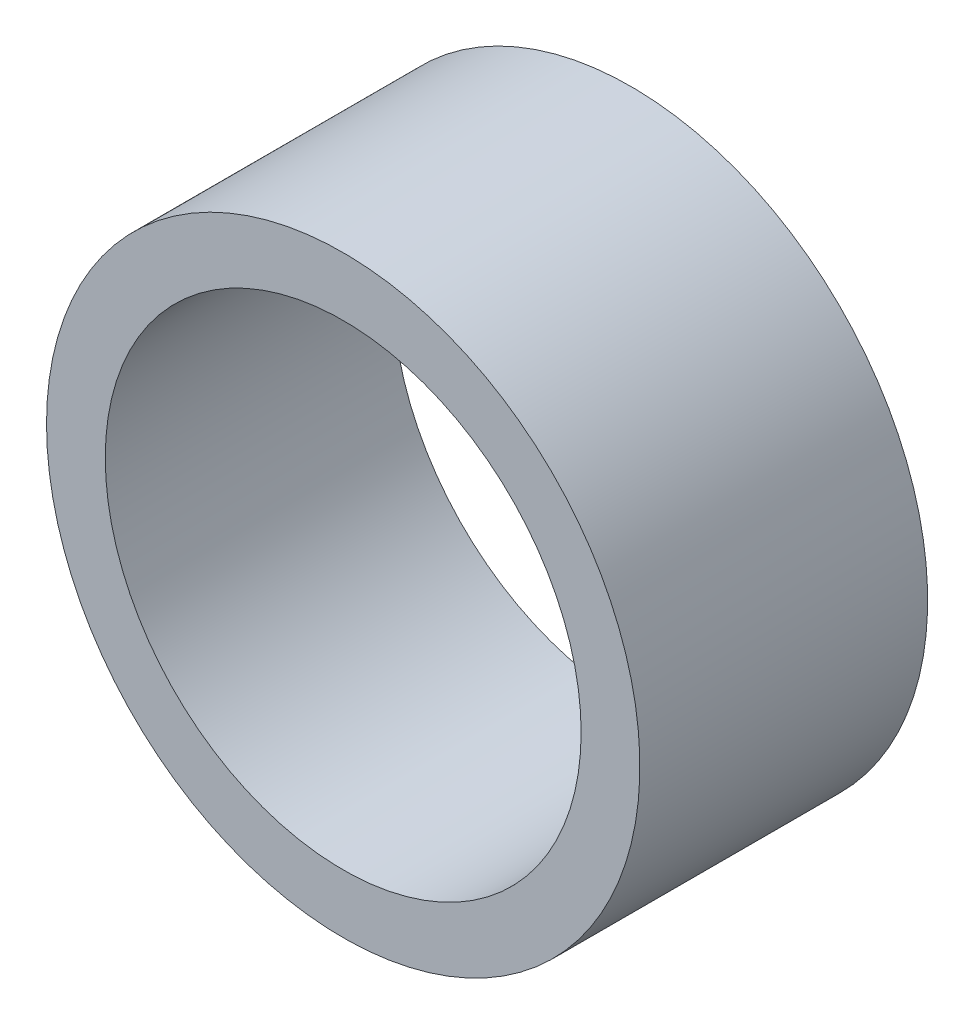
ISO-10303-21;
HEADER;
FILE_DESCRIPTION(('STEP AP214'),'2;1');
FILE_NAME('part.step','',(''),(''),'','','');
FILE_SCHEMA(('AUTOMOTIVE_DESIGN { 1 0 10303 214 1 1 1 1 }'));
ENDSEC;
DATA;
#1=APPLICATION_CONTEXT('core data for automotive mechanical design processes');
#2=APPLICATION_PROTOCOL_DEFINITION('international standard','automotive_design',2000,#1);
#3=PRODUCT_CONTEXT('',#1,'mechanical');
#4=PRODUCT('Part','Part','',(#3));
#5=PRODUCT_RELATED_PRODUCT_CATEGORY('part','',(#4));
#6=PRODUCT_DEFINITION_FORMATION('','',#4);
#7=PRODUCT_DEFINITION_CONTEXT('part definition',#1,'design');
#8=PRODUCT_DEFINITION('design','',#6,#7);
#9=PRODUCT_DEFINITION_SHAPE('','',#8);
#10=(LENGTH_UNIT() NAMED_UNIT(*) SI_UNIT(.MILLI.,.METRE.));
#11=(NAMED_UNIT(*) PLANE_ANGLE_UNIT() SI_UNIT($,.RADIAN.));
#12=(NAMED_UNIT(*) SI_UNIT($,.STERADIAN.) SOLID_ANGLE_UNIT());
#13=UNCERTAINTY_MEASURE_WITH_UNIT(LENGTH_MEASURE(1.E-05),#10,'distance_accuracy_value','');
#14=(GEOMETRIC_REPRESENTATION_CONTEXT(3) GLOBAL_UNCERTAINTY_ASSIGNED_CONTEXT((#13)) GLOBAL_UNIT_ASSIGNED_CONTEXT((#10,
#11,#12)) REPRESENTATION_CONTEXT('',''));
#15=CARTESIAN_POINT('',(0.,0.,0.));
#16=DIRECTION('',(0.,0.,1.));
#17=DIRECTION('',(1.,0.,0.));
#18=AXIS2_PLACEMENT_3D('',#15,#16,#17);
#19=CARTESIAN_POINT('',(0.,0.,24.25));
#20=DIRECTION('',(0.,0.,1.));
#21=DIRECTION('',(1.,0.,0.));
#22=AXIS2_PLACEMENT_3D('',#19,#20,#21);
#23=PLANE('',#22);
#24=CARTESIAN_POINT('',(0.,0.,24.25));
#25=DIRECTION('',(0.,0.,1.));
#26=DIRECTION('',(1.,0.,0.));
#27=AXIS2_PLACEMENT_3D('',#24,#25,#26);
#28=CIRCLE('',#27,25.);
#29=CARTESIAN_POINT('',(-25.,0.,24.25));
#30=VERTEX_POINT('',#29);
#31=EDGE_CURVE('E10',#30,#30,#28,.T.);
#32=ORIENTED_EDGE('',*,*,#31,.T.);
#33=EDGE_LOOP('',(#32));
#34=FACE_BOUND('',#33,.T.);
#35=CARTESIAN_POINT('',(0.,0.,24.25));
#36=DIRECTION('',(0.,0.,1.));
#37=DIRECTION('',(1.,0.,0.));
#38=AXIS2_PLACEMENT_3D('',#35,#36,#37);
#39=CIRCLE('',#38,20.05);
#40=CARTESIAN_POINT('',(-20.05,0.,24.25));
#41=VERTEX_POINT('',#40);
#42=EDGE_CURVE('E48',#41,#41,#39,.T.);
#43=ORIENTED_EDGE('',*,*,#42,.F.);
#44=EDGE_LOOP('',(#43));
#45=FACE_BOUND('',#44,.T.);
#46=ADVANCED_FACE('F37',(#34,#45),#23,.T.);
#47=CARTESIAN_POINT('',(0.,0.,0.));
#48=DIRECTION('',(0.,0.,1.));
#49=DIRECTION('',(1.,0.,0.));
#50=AXIS2_PLACEMENT_3D('',#47,#48,#49);
#51=PLANE('',#50);
#52=CARTESIAN_POINT('',(0.,0.,0.));
#53=DIRECTION('',(0.,0.,1.));
#54=DIRECTION('',(1.,0.,0.));
#55=AXIS2_PLACEMENT_3D('',#52,#53,#54);
#56=CIRCLE('',#55,25.);
#57=CARTESIAN_POINT('',(-25.,0.,0.));
#58=VERTEX_POINT('',#57);
#59=EDGE_CURVE('E41',#58,#58,#56,.T.);
#60=ORIENTED_EDGE('',*,*,#59,.F.);
#61=EDGE_LOOP('',(#60));
#62=FACE_BOUND('',#61,.T.);
#63=CARTESIAN_POINT('',(0.,0.,0.));
#64=DIRECTION('',(0.,0.,1.));
#65=DIRECTION('',(1.,0.,0.));
#66=AXIS2_PLACEMENT_3D('',#63,#64,#65);
#67=CIRCLE('',#66,20.05);
#68=CARTESIAN_POINT('',(-20.05,0.,0.));
#69=VERTEX_POINT('',#68);
#70=EDGE_CURVE('E50',#69,#69,#67,.T.);
#71=ORIENTED_EDGE('',*,*,#70,.T.);
#72=EDGE_LOOP('',(#71));
#73=FACE_BOUND('',#72,.T.);
#74=ADVANCED_FACE('F60',(#62,#73),#51,.F.);
#75=CARTESIAN_POINT('',(0.,0.,24.25));
#76=DIRECTION('',(0.,0.,-1.));
#77=DIRECTION('',(-1.,0.,0.));
#78=AXIS2_PLACEMENT_3D('',#75,#76,#77);
#79=CYLINDRICAL_SURFACE('',#78,25.);
#80=CARTESIAN_POINT('',(-25.,0.,24.25));
#81=CARTESIAN_POINT('',(-25.,0.,23.9973958333333));
#82=CARTESIAN_POINT('',(-25.,0.,23.7447916666667));
#83=CARTESIAN_POINT('',(-25.,0.,23.2395833333333));
#84=CARTESIAN_POINT('',(-25.,0.,22.9869791666667));
#85=CARTESIAN_POINT('',(-25.,0.,22.4817708333333));
#86=CARTESIAN_POINT('',(-25.,0.,22.2291666666667));
#87=CARTESIAN_POINT('',(-25.,0.,21.7239583333333));
#88=CARTESIAN_POINT('',(-25.,0.,21.4713541666667));
#89=CARTESIAN_POINT('',(-25.,0.,20.9661458333333));
#90=CARTESIAN_POINT('',(-25.,0.,20.7135416666667));
#91=CARTESIAN_POINT('',(-25.,0.,20.2083333333333));
#92=CARTESIAN_POINT('',(-25.,0.,19.9557291666667));
#93=CARTESIAN_POINT('',(-25.,0.,19.4505208333333));
#94=CARTESIAN_POINT('',(-25.,0.,19.1979166666667));
#95=CARTESIAN_POINT('',(-25.,0.,18.6927083333333));
#96=CARTESIAN_POINT('',(-25.,0.,18.4401041666667));
#97=CARTESIAN_POINT('',(-25.,0.,17.9348958333333));
#98=CARTESIAN_POINT('',(-25.,0.,17.6822916666667));
#99=CARTESIAN_POINT('',(-25.,0.,17.1770833333333));
#100=CARTESIAN_POINT('',(-25.,0.,16.9244791666667));
#101=CARTESIAN_POINT('',(-25.,0.,16.4192708333333));
#102=CARTESIAN_POINT('',(-25.,0.,16.1666666666667));
#103=CARTESIAN_POINT('',(-25.,0.,15.6614583333333));
#104=CARTESIAN_POINT('',(-25.,0.,15.4088541666667));
#105=CARTESIAN_POINT('',(-25.,0.,14.9036458333333));
#106=CARTESIAN_POINT('',(-25.,0.,14.6510416666667));
#107=CARTESIAN_POINT('',(-25.,0.,14.1458333333333));
#108=CARTESIAN_POINT('',(-25.,0.,13.8932291666667));
#109=CARTESIAN_POINT('',(-25.,0.,13.3880208333333));
#110=CARTESIAN_POINT('',(-25.,0.,13.1354166666667));
#111=CARTESIAN_POINT('',(-25.,0.,12.6302083333333));
#112=CARTESIAN_POINT('',(-25.,0.,12.3776041666667));
#113=CARTESIAN_POINT('',(-25.,0.,11.8723958333333));
#114=CARTESIAN_POINT('',(-25.,0.,11.6197916666667));
#115=CARTESIAN_POINT('',(-25.,0.,11.1145833333333));
#116=CARTESIAN_POINT('',(-25.,0.,10.8619791666667));
#117=CARTESIAN_POINT('',(-25.,0.,10.3567708333333));
#118=CARTESIAN_POINT('',(-25.,0.,10.1041666666667));
#119=CARTESIAN_POINT('',(-25.,0.,9.59895833333333));
#120=CARTESIAN_POINT('',(-25.,0.,9.34635416666666));
#121=CARTESIAN_POINT('',(-25.,0.,8.84114583333333));
#122=CARTESIAN_POINT('',(-25.,0.,8.58854166666666));
#123=CARTESIAN_POINT('',(-25.,0.,8.08333333333333));
#124=CARTESIAN_POINT('',(-25.,0.,7.83072916666666));
#125=CARTESIAN_POINT('',(-25.,0.,7.32552083333333));
#126=CARTESIAN_POINT('',(-25.,0.,7.07291666666667));
#127=CARTESIAN_POINT('',(-25.,0.,6.56770833333333));
#128=CARTESIAN_POINT('',(-25.,0.,6.31510416666667));
#129=CARTESIAN_POINT('',(-25.,0.,5.80989583333333));
#130=CARTESIAN_POINT('',(-25.,0.,5.55729166666667));
#131=CARTESIAN_POINT('',(-25.,0.,5.05208333333333));
#132=CARTESIAN_POINT('',(-25.,0.,4.79947916666667));
#133=CARTESIAN_POINT('',(-25.,0.,4.29427083333333));
#134=CARTESIAN_POINT('',(-25.,0.,4.04166666666667));
#135=CARTESIAN_POINT('',(-25.,0.,3.53645833333333));
#136=CARTESIAN_POINT('',(-25.,0.,3.28385416666666));
#137=CARTESIAN_POINT('',(-25.,0.,2.77864583333333));
#138=CARTESIAN_POINT('',(-25.,0.,2.52604166666666));
#139=CARTESIAN_POINT('',(-25.,0.,2.02083333333333));
#140=CARTESIAN_POINT('',(-25.,0.,1.76822916666666));
#141=CARTESIAN_POINT('',(-25.,0.,1.26302083333333));
#142=CARTESIAN_POINT('',(-25.,0.,1.01041666666666));
#143=CARTESIAN_POINT('',(-25.,0.,0.50520833333333));
#144=CARTESIAN_POINT('',(-25.,0.,0.252604166666663));
#145=CARTESIAN_POINT('',(-25.,0.,0.));
#146=B_SPLINE_CURVE_WITH_KNOTS('',3,(#80,#81,#82,#83,#84,#85,#86,#87,#88,#89,#90,#91,#92,#93,
#94,#95,#96,#97,#98,#99,#100,#101,#102,#103,#104,#105,#106,#107,#108,#109,#110,#111,#112,#113,
#114,#115,#116,#117,#118,#119,#120,#121,#122,#123,#124,#125,#126,#127,#128,#129,#130,#131,#132,
#133,#134,#135,#136,#137,#138,#139,#140,#141,#142,#143,#144,#145),.UNSPECIFIED.,.F.,.F.,(4,2,2,
2,2,2,2,2,2,2,2,2,2,2,2,2,2,2,2,2,2,2,2,2,2,2,2,2,2,2,2,2,4),(0.,0.757812500000003,1.515625,
2.2734375,3.03125,3.7890625,4.546875,5.3046875,6.0625,6.8203125,7.57812500000001,8.3359375,
9.09375,9.8515625,10.609375,11.3671875,12.125,12.8828125,13.640625,14.3984375,15.15625,
15.9140625,16.671875,17.4296875,18.1875,18.9453125,19.703125,20.4609375,21.21875,21.9765625,
22.734375,23.4921875,24.25),.UNSPECIFIED.);
#147=EDGE_CURVE('BSEAM39',#30,#58,#146,.T.);
#148=ORIENTED_EDGE('',*,*,#31,.F.);
#149=ORIENTED_EDGE('',*,*,#59,.T.);
#150=ORIENTED_EDGE('',*,*,#147,.T.);
#151=ORIENTED_EDGE('',*,*,#147,.F.);
#152=EDGE_LOOP('',(#148,#150,#149,#151));
#153=FACE_BOUND('',#152,.T.);
#154=ADVANCED_FACE('F39',(#153),#79,.T.);
#155=CARTESIAN_POINT('',(0.,0.,24.25));
#156=DIRECTION('',(0.,0.,-1.));
#157=DIRECTION('',(-1.,0.,0.));
#158=AXIS2_PLACEMENT_3D('',#155,#156,#157);
#159=CYLINDRICAL_SURFACE('',#158,20.05);
#160=CARTESIAN_POINT('',(-20.05,0.,24.25));
#161=CARTESIAN_POINT('',(-20.05,0.,23.9973958333333));
#162=CARTESIAN_POINT('',(-20.05,0.,23.7447916666667));
#163=CARTESIAN_POINT('',(-20.05,0.,23.2395833333333));
#164=CARTESIAN_POINT('',(-20.05,0.,22.9869791666667));
#165=CARTESIAN_POINT('',(-20.05,0.,22.4817708333333));
#166=CARTESIAN_POINT('',(-20.05,0.,22.2291666666667));
#167=CARTESIAN_POINT('',(-20.05,0.,21.7239583333333));
#168=CARTESIAN_POINT('',(-20.05,0.,21.4713541666667));
#169=CARTESIAN_POINT('',(-20.05,0.,20.9661458333333));
#170=CARTESIAN_POINT('',(-20.05,0.,20.7135416666667));
#171=CARTESIAN_POINT('',(-20.05,0.,20.2083333333333));
#172=CARTESIAN_POINT('',(-20.05,0.,19.9557291666667));
#173=CARTESIAN_POINT('',(-20.05,0.,19.4505208333333));
#174=CARTESIAN_POINT('',(-20.05,0.,19.1979166666667));
#175=CARTESIAN_POINT('',(-20.05,0.,18.6927083333333));
#176=CARTESIAN_POINT('',(-20.05,0.,18.4401041666667));
#177=CARTESIAN_POINT('',(-20.05,0.,17.9348958333333));
#178=CARTESIAN_POINT('',(-20.05,0.,17.6822916666667));
#179=CARTESIAN_POINT('',(-20.05,0.,17.1770833333333));
#180=CARTESIAN_POINT('',(-20.05,0.,16.9244791666667));
#181=CARTESIAN_POINT('',(-20.05,0.,16.4192708333333));
#182=CARTESIAN_POINT('',(-20.05,0.,16.1666666666667));
#183=CARTESIAN_POINT('',(-20.05,0.,15.6614583333333));
#184=CARTESIAN_POINT('',(-20.05,0.,15.4088541666667));
#185=CARTESIAN_POINT('',(-20.05,0.,14.9036458333333));
#186=CARTESIAN_POINT('',(-20.05,0.,14.6510416666667));
#187=CARTESIAN_POINT('',(-20.05,0.,14.1458333333333));
#188=CARTESIAN_POINT('',(-20.05,0.,13.8932291666667));
#189=CARTESIAN_POINT('',(-20.05,0.,13.3880208333333));
#190=CARTESIAN_POINT('',(-20.05,0.,13.1354166666667));
#191=CARTESIAN_POINT('',(-20.05,0.,12.6302083333333));
#192=CARTESIAN_POINT('',(-20.05,0.,12.3776041666667));
#193=CARTESIAN_POINT('',(-20.05,0.,11.8723958333333));
#194=CARTESIAN_POINT('',(-20.05,0.,11.6197916666667));
#195=CARTESIAN_POINT('',(-20.05,0.,11.1145833333333));
#196=CARTESIAN_POINT('',(-20.05,0.,10.8619791666667));
#197=CARTESIAN_POINT('',(-20.05,0.,10.3567708333333));
#198=CARTESIAN_POINT('',(-20.05,0.,10.1041666666667));
#199=CARTESIAN_POINT('',(-20.05,0.,9.59895833333333));
#200=CARTESIAN_POINT('',(-20.05,0.,9.34635416666666));
#201=CARTESIAN_POINT('',(-20.05,0.,8.84114583333333));
#202=CARTESIAN_POINT('',(-20.05,0.,8.58854166666666));
#203=CARTESIAN_POINT('',(-20.05,0.,8.08333333333333));
#204=CARTESIAN_POINT('',(-20.05,0.,7.83072916666666));
#205=CARTESIAN_POINT('',(-20.05,0.,7.32552083333333));
#206=CARTESIAN_POINT('',(-20.05,0.,7.07291666666667));
#207=CARTESIAN_POINT('',(-20.05,0.,6.56770833333333));
#208=CARTESIAN_POINT('',(-20.05,0.,6.31510416666667));
#209=CARTESIAN_POINT('',(-20.05,0.,5.80989583333333));
#210=CARTESIAN_POINT('',(-20.05,0.,5.55729166666667));
#211=CARTESIAN_POINT('',(-20.05,0.,5.05208333333333));
#212=CARTESIAN_POINT('',(-20.05,0.,4.79947916666667));
#213=CARTESIAN_POINT('',(-20.05,0.,4.29427083333333));
#214=CARTESIAN_POINT('',(-20.05,0.,4.04166666666667));
#215=CARTESIAN_POINT('',(-20.05,0.,3.53645833333333));
#216=CARTESIAN_POINT('',(-20.05,0.,3.28385416666666));
#217=CARTESIAN_POINT('',(-20.05,0.,2.77864583333333));
#218=CARTESIAN_POINT('',(-20.05,0.,2.52604166666666));
#219=CARTESIAN_POINT('',(-20.05,0.,2.02083333333333));
#220=CARTESIAN_POINT('',(-20.05,0.,1.76822916666666));
#221=CARTESIAN_POINT('',(-20.05,0.,1.26302083333333));
#222=CARTESIAN_POINT('',(-20.05,0.,1.01041666666666));
#223=CARTESIAN_POINT('',(-20.05,0.,0.50520833333333));
#224=CARTESIAN_POINT('',(-20.05,0.,0.252604166666663));
#225=CARTESIAN_POINT('',(-20.05,0.,0.));
#226=B_SPLINE_CURVE_WITH_KNOTS('',3,(#160,#161,#162,#163,#164,#165,#166,#167,#168,#169,#170,
#171,#172,#173,#174,#175,#176,#177,#178,#179,#180,#181,#182,#183,#184,#185,#186,#187,#188,#189,
#190,#191,#192,#193,#194,#195,#196,#197,#198,#199,#200,#201,#202,#203,#204,#205,#206,#207,#208,
#209,#210,#211,#212,#213,#214,#215,#216,#217,#218,#219,#220,#221,#222,#223,#224,#225),
.UNSPECIFIED.,.F.,.F.,(4,2,2,2,2,2,2,2,2,2,2,2,2,2,2,2,2,2,2,2,2,2,2,2,2,2,2,2,2,2,2,2,4),(0.,
0.757812500000003,1.515625,2.2734375,3.03125,3.7890625,4.546875,5.3046875,6.0625,6.8203125,
7.57812500000001,8.3359375,9.09375,9.8515625,10.609375,11.3671875,12.125,12.8828125,13.640625,
14.3984375,15.15625,15.9140625,16.671875,17.4296875,18.1875,18.9453125,19.703125,20.4609375,
21.21875,21.9765625,22.734375,23.4921875,24.25),.UNSPECIFIED.);
#227=EDGE_CURVE('BSEAM56',#41,#69,#226,.T.);
#228=ORIENTED_EDGE('',*,*,#42,.T.);
#229=ORIENTED_EDGE('',*,*,#70,.F.);
#230=ORIENTED_EDGE('',*,*,#227,.T.);
#231=ORIENTED_EDGE('',*,*,#227,.F.);
#232=EDGE_LOOP('',(#228,#230,#229,#231));
#233=FACE_BOUND('',#232,.T.);
#234=ADVANCED_FACE('F56',(#233),#159,.F.);
#235=CLOSED_SHELL('',(#46,#74,#154,#234));
#236=MANIFOLD_SOLID_BREP('B2',#235);
#237=ADVANCED_BREP_SHAPE_REPRESENTATION('',(#18,#236),#14);
#238=SHAPE_DEFINITION_REPRESENTATION(#9,#237);
ENDSEC;
END-ISO-10303-21;
